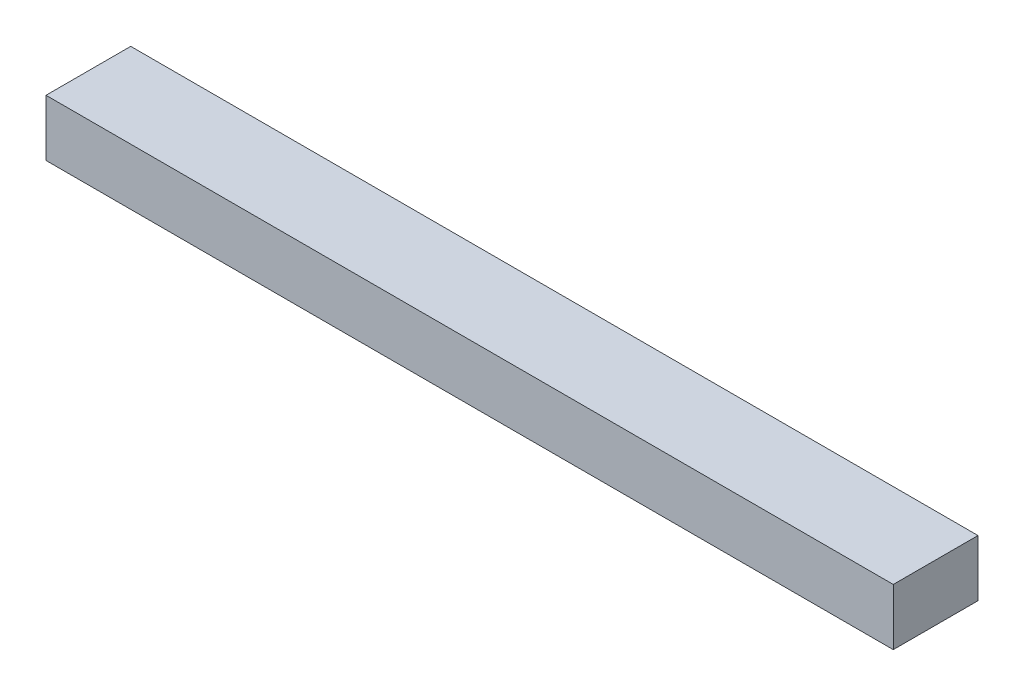
ISO-10303-21;
HEADER;
FILE_DESCRIPTION(('STEP AP214'),'2;1');
FILE_NAME('part.step','',(''),(''),'','','');
FILE_SCHEMA(('AUTOMOTIVE_DESIGN { 1 0 10303 214 1 1 1 1 }'));
ENDSEC;
DATA;
#1=APPLICATION_CONTEXT('core data for automotive mechanical design processes');
#2=APPLICATION_PROTOCOL_DEFINITION('international standard','automotive_design',2000,#1);
#3=PRODUCT_CONTEXT('',#1,'mechanical');
#4=PRODUCT('Part','Part','',(#3));
#5=PRODUCT_RELATED_PRODUCT_CATEGORY('part','',(#4));
#6=PRODUCT_DEFINITION_FORMATION('','',#4);
#7=PRODUCT_DEFINITION_CONTEXT('part definition',#1,'design');
#8=PRODUCT_DEFINITION('design','',#6,#7);
#9=PRODUCT_DEFINITION_SHAPE('','',#8);
#10=(LENGTH_UNIT() NAMED_UNIT(*) SI_UNIT(.MILLI.,.METRE.));
#11=(NAMED_UNIT(*) PLANE_ANGLE_UNIT() SI_UNIT($,.RADIAN.));
#12=(NAMED_UNIT(*) SI_UNIT($,.STERADIAN.) SOLID_ANGLE_UNIT());
#13=UNCERTAINTY_MEASURE_WITH_UNIT(LENGTH_MEASURE(1.E-05),#10,'distance_accuracy_value','');
#14=(GEOMETRIC_REPRESENTATION_CONTEXT(3) GLOBAL_UNCERTAINTY_ASSIGNED_CONTEXT((#13)) GLOBAL_UNIT_ASSIGNED_CONTEXT((#10,
#11,#12)) REPRESENTATION_CONTEXT('',''));
#15=CARTESIAN_POINT('',(0.,0.,0.));
#16=DIRECTION('',(0.,0.,1.));
#17=DIRECTION('',(1.,0.,0.));
#18=AXIS2_PLACEMENT_3D('',#15,#16,#17);
#19=CARTESIAN_POINT('',(300.,6.17647058823529,11.7907353361078));
#20=DIRECTION('',(0.,0.,-1.));
#21=DIRECTION('',(0.,1.,0.));
#22=AXIS2_PLACEMENT_3D('',#19,#20,#21);
#23=PLANE('',#22);
#24=DIRECTION('',(0.,-1.,0.));
#25=VECTOR('',#24,1.);
#26=CARTESIAN_POINT('',(0.,6.17647058823529,11.7907353361078));
#27=LINE('',#26,#25);
#28=CARTESIAN_POINT('',(0.,6.17647058823529,11.7907353361078));
#29=VERTEX_POINT('',#28);
#30=CARTESIAN_POINT('',(0.,-13.8235294117647,11.7907353361078));
#31=VERTEX_POINT('',#30);
#32=EDGE_CURVE('E107',#29,#31,#27,.T.);
#33=ORIENTED_EDGE('',*,*,#32,.T.);
#34=DIRECTION('',(-1.,0.,0.));
#35=VECTOR('',#34,1.);
#36=CARTESIAN_POINT('',(300.,-13.8235294117647,11.7907353361078));
#37=LINE('',#36,#35);
#38=CARTESIAN_POINT('',(300.,-13.8235294117647,11.7907353361078));
#39=VERTEX_POINT('',#38);
#40=EDGE_CURVE('E11',#39,#31,#37,.T.);
#41=ORIENTED_EDGE('',*,*,#40,.F.);
#42=DIRECTION('',(0.,-1.,0.));
#43=VECTOR('',#42,1.);
#44=CARTESIAN_POINT('',(300.,6.17647058823529,11.7907353361078));
#45=LINE('',#44,#43);
#46=CARTESIAN_POINT('',(300.,6.17647058823529,11.7907353361078));
#47=VERTEX_POINT('',#46);
#48=EDGE_CURVE('E91',#47,#39,#45,.T.);
#49=ORIENTED_EDGE('',*,*,#48,.F.);
#50=DIRECTION('',(-1.,0.,0.));
#51=VECTOR('',#50,1.);
#52=CARTESIAN_POINT('',(300.,6.17647058823529,11.7907353361078));
#53=LINE('',#52,#51);
#54=EDGE_CURVE('E103',#47,#29,#53,.T.);
#55=ORIENTED_EDGE('',*,*,#54,.T.);
#56=EDGE_LOOP('',(#33,#41,#49,#55));
#57=FACE_BOUND('',#56,.T.);
#58=ADVANCED_FACE('F39',(#57),#23,.F.);
#59=CARTESIAN_POINT('',(300.,-13.8235294117647,11.7907353361078));
#60=DIRECTION('',(0.,1.,0.));
#61=DIRECTION('',(0.,0.,1.));
#62=AXIS2_PLACEMENT_3D('',#59,#60,#61);
#63=PLANE('',#62);
#64=DIRECTION('',(0.,0.,-1.));
#65=VECTOR('',#64,1.);
#66=CARTESIAN_POINT('',(0.,-13.8235294117647,11.7907353361078));
#67=LINE('',#66,#65);
#68=CARTESIAN_POINT('',(0.,-13.8235294117647,-18.2092646638922));
#69=VERTEX_POINT('',#68);
#70=EDGE_CURVE('E96',#31,#69,#67,.T.);
#71=ORIENTED_EDGE('',*,*,#70,.T.);
#72=DIRECTION('',(-1.,0.,0.));
#73=VECTOR('',#72,1.);
#74=CARTESIAN_POINT('',(300.,-13.8235294117647,-18.2092646638922));
#75=LINE('',#74,#73);
#76=CARTESIAN_POINT('',(300.,-13.8235294117647,-18.2092646638922));
#77=VERTEX_POINT('',#76);
#78=EDGE_CURVE('E48',#77,#69,#75,.T.);
#79=ORIENTED_EDGE('',*,*,#78,.F.);
#80=DIRECTION('',(0.,0.,-1.));
#81=VECTOR('',#80,1.);
#82=CARTESIAN_POINT('',(300.,-13.8235294117647,11.7907353361078));
#83=LINE('',#82,#81);
#84=EDGE_CURVE('E86',#39,#77,#83,.T.);
#85=ORIENTED_EDGE('',*,*,#84,.F.);
#86=ORIENTED_EDGE('',*,*,#40,.T.);
#87=EDGE_LOOP('',(#71,#79,#85,#86));
#88=FACE_BOUND('',#87,.T.);
#89=ADVANCED_FACE('F95',(#88),#63,.F.);
#90=CARTESIAN_POINT('',(300.,6.17647058823529,-18.2092646638922));
#91=DIRECTION('',(0.,0.,1.));
#92=DIRECTION('',(1.,0.,0.));
#93=AXIS2_PLACEMENT_3D('',#90,#91,#92);
#94=PLANE('',#93);
#95=DIRECTION('',(0.,1.,0.));
#96=VECTOR('',#95,1.);
#97=CARTESIAN_POINT('',(0.,6.17647058823529,-18.2092646638922));
#98=LINE('',#97,#96);
#99=CARTESIAN_POINT('',(0.,6.17647058823529,-18.2092646638922));
#100=VERTEX_POINT('',#99);
#101=EDGE_CURVE('E73',#69,#100,#98,.T.);
#102=ORIENTED_EDGE('',*,*,#101,.T.);
#103=DIRECTION('',(-1.,0.,0.));
#104=VECTOR('',#103,1.);
#105=CARTESIAN_POINT('',(300.,6.17647058823529,-18.2092646638922));
#106=LINE('',#105,#104);
#107=CARTESIAN_POINT('',(300.,6.17647058823529,-18.2092646638922));
#108=VERTEX_POINT('',#107);
#109=EDGE_CURVE('E98',#108,#100,#106,.T.);
#110=ORIENTED_EDGE('',*,*,#109,.F.);
#111=DIRECTION('',(0.,1.,0.));
#112=VECTOR('',#111,1.);
#113=CARTESIAN_POINT('',(300.,6.17647058823529,-18.2092646638922));
#114=LINE('',#113,#112);
#115=EDGE_CURVE('E89',#77,#108,#114,.T.);
#116=ORIENTED_EDGE('',*,*,#115,.F.);
#117=ORIENTED_EDGE('',*,*,#78,.T.);
#118=EDGE_LOOP('',(#102,#110,#116,#117));
#119=FACE_BOUND('',#118,.T.);
#120=ADVANCED_FACE('F99',(#119),#94,.F.);
#121=CARTESIAN_POINT('',(300.,6.17647058823529,11.7907353361078));
#122=DIRECTION('',(0.,-1.,0.));
#123=DIRECTION('',(0.,0.,-1.));
#124=AXIS2_PLACEMENT_3D('',#121,#122,#123);
#125=PLANE('',#124);
#126=DIRECTION('',(0.,0.,1.));
#127=VECTOR('',#126,1.);
#128=CARTESIAN_POINT('',(0.,6.17647058823529,11.7907353361078));
#129=LINE('',#128,#127);
#130=EDGE_CURVE('E79',#100,#29,#129,.T.);
#131=ORIENTED_EDGE('',*,*,#130,.T.);
#132=ORIENTED_EDGE('',*,*,#54,.F.);
#133=DIRECTION('',(0.,0.,1.));
#134=VECTOR('',#133,1.);
#135=CARTESIAN_POINT('',(300.,6.17647058823529,11.7907353361078));
#136=LINE('',#135,#134);
#137=EDGE_CURVE('E56',#108,#47,#136,.T.);
#138=ORIENTED_EDGE('',*,*,#137,.F.);
#139=ORIENTED_EDGE('',*,*,#109,.T.);
#140=EDGE_LOOP('',(#131,#132,#138,#139));
#141=FACE_BOUND('',#140,.T.);
#142=ADVANCED_FACE('F120',(#141),#125,.F.);
#143=CARTESIAN_POINT('',(300.,0.,0.));
#144=DIRECTION('',(1.,0.,0.));
#145=DIRECTION('',(0.,0.,-1.));
#146=AXIS2_PLACEMENT_3D('',#143,#144,#145);
#147=PLANE('',#146);
#148=ORIENTED_EDGE('',*,*,#48,.T.);
#149=ORIENTED_EDGE('',*,*,#84,.T.);
#150=ORIENTED_EDGE('',*,*,#115,.T.);
#151=ORIENTED_EDGE('',*,*,#137,.T.);
#152=EDGE_LOOP('',(#148,#149,#150,#151));
#153=FACE_BOUND('',#152,.T.);
#154=ADVANCED_FACE('F87',(#153),#147,.T.);
#155=CARTESIAN_POINT('',(0.,0.,0.));
#156=DIRECTION('',(1.,0.,0.));
#157=DIRECTION('',(0.,0.,-1.));
#158=AXIS2_PLACEMENT_3D('',#155,#156,#157);
#159=PLANE('',#158);
#160=ORIENTED_EDGE('',*,*,#32,.F.);
#161=ORIENTED_EDGE('',*,*,#130,.F.);
#162=ORIENTED_EDGE('',*,*,#101,.F.);
#163=ORIENTED_EDGE('',*,*,#70,.F.);
#164=EDGE_LOOP('',(#160,#161,#162,#163));
#165=FACE_BOUND('',#164,.T.);
#166=ADVANCED_FACE('F123',(#165),#159,.F.);
#167=CLOSED_SHELL('',(#58,#89,#120,#142,#154,#166));
#168=MANIFOLD_SOLID_BREP('B2',#167);
#169=ADVANCED_BREP_SHAPE_REPRESENTATION('',(#18,#168),#14);
#170=SHAPE_DEFINITION_REPRESENTATION(#9,#169);
ENDSEC;
END-ISO-10303-21;
